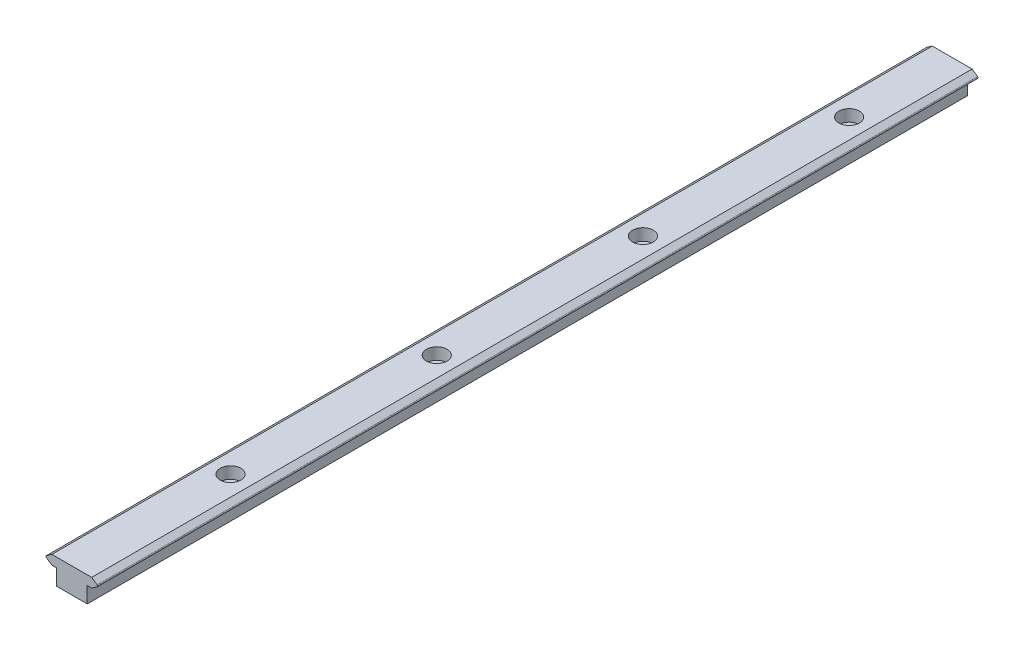
ISO-10303-21;
HEADER;
FILE_DESCRIPTION(('STEP AP214'),'2;1');
FILE_NAME('part.step','',(''),(''),'','','');
FILE_SCHEMA(('AUTOMOTIVE_DESIGN { 1 0 10303 214 1 1 1 1 }'));
ENDSEC;
DATA;
#1=APPLICATION_CONTEXT('core data for automotive mechanical design processes');
#2=APPLICATION_PROTOCOL_DEFINITION('international standard','automotive_design',2000,#1);
#3=PRODUCT_CONTEXT('',#1,'mechanical');
#4=PRODUCT('Part','Part','',(#3));
#5=PRODUCT_RELATED_PRODUCT_CATEGORY('part','',(#4));
#6=PRODUCT_DEFINITION_FORMATION('','',#4);
#7=PRODUCT_DEFINITION_CONTEXT('part definition',#1,'design');
#8=PRODUCT_DEFINITION('design','',#6,#7);
#9=PRODUCT_DEFINITION_SHAPE('','',#8);
#10=(LENGTH_UNIT() NAMED_UNIT(*) SI_UNIT(.MILLI.,.METRE.));
#11=(NAMED_UNIT(*) PLANE_ANGLE_UNIT() SI_UNIT($,.RADIAN.));
#12=(NAMED_UNIT(*) SI_UNIT($,.STERADIAN.) SOLID_ANGLE_UNIT());
#13=UNCERTAINTY_MEASURE_WITH_UNIT(LENGTH_MEASURE(1.E-05),#10,'distance_accuracy_value','');
#14=(GEOMETRIC_REPRESENTATION_CONTEXT(3) GLOBAL_UNCERTAINTY_ASSIGNED_CONTEXT((#13)) GLOBAL_UNIT_ASSIGNED_CONTEXT((#10,
#11,#12)) REPRESENTATION_CONTEXT('',''));
#15=CARTESIAN_POINT('',(0.,0.,0.));
#16=DIRECTION('',(0.,0.,1.));
#17=DIRECTION('',(1.,0.,0.));
#18=AXIS2_PLACEMENT_3D('',#15,#16,#17);
#19=CARTESIAN_POINT('',(185.15666698483,2.25000000000001,0.));
#20=DIRECTION('',(0.,1.,0.));
#21=DIRECTION('',(0.,0.,1.));
#22=AXIS2_PLACEMENT_3D('',#19,#20,#21);
#23=PLANE('',#22);
#24=CARTESIAN_POINT('',(-175.5,2.25000000000001,50.));
#25=DIRECTION('',(0.,1.,0.));
#26=DIRECTION('',(0.,0.,1.));
#27=AXIS2_PLACEMENT_3D('',#24,#25,#26);
#28=CIRCLE('',#27,5.);
#29=CARTESIAN_POINT('',(-175.5,2.25000000000001,55.));
#30=VERTEX_POINT('',#29);
#31=EDGE_CURVE('E321',#30,#30,#28,.T.);
#32=ORIENTED_EDGE('',*,*,#31,.F.);
#33=EDGE_LOOP('',(#32));
#34=FACE_BOUND('',#33,.T.);
#35=CARTESIAN_POINT('',(-175.499999999999,2.25000000000001,150.));
#36=DIRECTION('',(0.,1.,0.));
#37=DIRECTION('',(0.,0.,1.));
#38=AXIS2_PLACEMENT_3D('',#35,#36,#37);
#39=CIRCLE('',#38,5.);
#40=CARTESIAN_POINT('',(-175.499999999999,2.25000000000001,155.));
#41=VERTEX_POINT('',#40);
#42=EDGE_CURVE('E309',#41,#41,#39,.T.);
#43=ORIENTED_EDGE('',*,*,#42,.F.);
#44=EDGE_LOOP('',(#43));
#45=FACE_BOUND('',#44,.T.);
#46=CARTESIAN_POINT('',(-175.499999999997,2.25000000000001,350.));
#47=DIRECTION('',(0.,1.,0.));
#48=DIRECTION('',(0.,0.,1.));
#49=AXIS2_PLACEMENT_3D('',#46,#47,#48);
#50=CIRCLE('',#49,5.);
#51=CARTESIAN_POINT('',(-175.499999999997,2.25000000000001,355.));
#52=VERTEX_POINT('',#51);
#53=EDGE_CURVE('E297',#52,#52,#50,.T.);
#54=ORIENTED_EDGE('',*,*,#53,.F.);
#55=EDGE_LOOP('',(#54));
#56=FACE_BOUND('',#55,.T.);
#57=CARTESIAN_POINT('',(-175.499999999998,2.25000000000001,250.));
#58=DIRECTION('',(0.,1.,0.));
#59=DIRECTION('',(0.,0.,1.));
#60=AXIS2_PLACEMENT_3D('',#57,#58,#59);
#61=CIRCLE('',#60,5.);
#62=CARTESIAN_POINT('',(-175.499999999998,2.25000000000001,255.));
#63=VERTEX_POINT('',#62);
#64=EDGE_CURVE('E285',#63,#63,#61,.T.);
#65=ORIENTED_EDGE('',*,*,#64,.F.);
#66=EDGE_LOOP('',(#65));
#67=FACE_BOUND('',#66,.T.);
#68=DIRECTION('',(1.,0.,0.));
#69=VECTOR('',#68,1.);
#70=CARTESIAN_POINT('',(185.15666698483,2.25000000000001,0.));
#71=LINE('',#70,#69);
#72=CARTESIAN_POINT('',(-185.15666698483,2.25000000000001,0.));
#73=VERTEX_POINT('',#72);
#74=CARTESIAN_POINT('',(-165.84333301517,2.25000000000001,0.));
#75=VERTEX_POINT('',#74);
#76=EDGE_CURVE('E125',#73,#75,#71,.T.);
#77=ORIENTED_EDGE('',*,*,#76,.F.);
#78=DIRECTION('',(0.,0.,-1.));
#79=VECTOR('',#78,1.);
#80=CARTESIAN_POINT('',(-185.15666698483,2.25000000000001,427.));
#81=LINE('',#80,#79);
#82=CARTESIAN_POINT('',(-185.15666698483,2.25000000000001,427.));
#83=VERTEX_POINT('',#82);
#84=EDGE_CURVE('E172',#83,#73,#81,.T.);
#85=ORIENTED_EDGE('',*,*,#84,.F.);
#86=DIRECTION('',(-1.,0.,0.));
#87=VECTOR('',#86,1.);
#88=CARTESIAN_POINT('',(-165.84333301517,2.25000000000001,427.));
#89=LINE('',#88,#87);
#90=CARTESIAN_POINT('',(-165.84333301517,2.25000000000001,427.));
#91=VERTEX_POINT('',#90);
#92=EDGE_CURVE('E203',#91,#83,#89,.T.);
#93=ORIENTED_EDGE('',*,*,#92,.F.);
#94=DIRECTION('',(0.,0.,-1.));
#95=VECTOR('',#94,1.);
#96=CARTESIAN_POINT('',(-165.84333301517,2.25000000000001,427.));
#97=LINE('',#96,#95);
#98=EDGE_CURVE('E142',#91,#75,#97,.T.);
#99=ORIENTED_EDGE('',*,*,#98,.T.);
#100=EDGE_LOOP('',(#77,#85,#93,#99));
#101=FACE_BOUND('',#100,.T.);
#102=ADVANCED_FACE('F36',(#34,#45,#56,#67,#101),#23,.T.);
#103=CARTESIAN_POINT('',(0.,-2.25,0.));
#104=DIRECTION('',(0.,-1.,0.));
#105=DIRECTION('',(0.,0.,-1.));
#106=AXIS2_PLACEMENT_3D('',#103,#104,#105);
#107=PLANE('',#106);
#108=DIRECTION('',(-1.,0.,0.));
#109=VECTOR('',#108,1.);
#110=CARTESIAN_POINT('',(0.,-2.25,0.));
#111=LINE('',#110,#109);
#112=CARTESIAN_POINT('',(-183.,-2.25,0.));
#113=VERTEX_POINT('',#112);
#114=CARTESIAN_POINT('',(-185.15666698483,-2.25,0.));
#115=VERTEX_POINT('',#114);
#116=EDGE_CURVE('E237',#113,#115,#111,.T.);
#117=ORIENTED_EDGE('',*,*,#116,.F.);
#118=DIRECTION('',(0.,0.,-1.));
#119=VECTOR('',#118,1.);
#120=CARTESIAN_POINT('',(-183.,-2.25,427.));
#121=LINE('',#120,#119);
#122=CARTESIAN_POINT('',(-183.,-2.25,427.));
#123=VERTEX_POINT('',#122);
#124=EDGE_CURVE('E160',#123,#113,#121,.T.);
#125=ORIENTED_EDGE('',*,*,#124,.F.);
#126=DIRECTION('',(1.,0.,0.));
#127=VECTOR('',#126,1.);
#128=CARTESIAN_POINT('',(-185.15666698483,-2.25,427.));
#129=LINE('',#128,#127);
#130=CARTESIAN_POINT('',(-185.15666698483,-2.25,427.));
#131=VERTEX_POINT('',#130);
#132=EDGE_CURVE('E201',#131,#123,#129,.T.);
#133=ORIENTED_EDGE('',*,*,#132,.F.);
#134=DIRECTION('',(0.,0.,-1.));
#135=VECTOR('',#134,1.);
#136=CARTESIAN_POINT('',(-185.15666698483,-2.25,427.));
#137=LINE('',#136,#135);
#138=EDGE_CURVE('E163',#131,#115,#137,.T.);
#139=ORIENTED_EDGE('',*,*,#138,.T.);
#140=EDGE_LOOP('',(#117,#125,#133,#139));
#141=FACE_BOUND('',#140,.T.);
#142=ADVANCED_FACE('F227',(#141),#107,.T.);
#143=CARTESIAN_POINT('',(0.,-9.99999999999999,0.));
#144=DIRECTION('',(0.,-1.,0.));
#145=DIRECTION('',(0.,0.,-1.));
#146=AXIS2_PLACEMENT_3D('',#143,#144,#145);
#147=PLANE('',#146);
#148=CARTESIAN_POINT('',(-175.5,-10.,50.));
#149=DIRECTION('',(0.,1.,0.));
#150=DIRECTION('',(0.,0.,1.));
#151=AXIS2_PLACEMENT_3D('',#148,#149,#150);
#152=CIRCLE('',#151,2.75);
#153=CARTESIAN_POINT('',(-175.5,-10.,52.75));
#154=VERTEX_POINT('',#153);
#155=EDGE_CURVE('E312',#154,#154,#152,.T.);
#156=ORIENTED_EDGE('',*,*,#155,.T.);
#157=EDGE_LOOP('',(#156));
#158=FACE_BOUND('',#157,.T.);
#159=CARTESIAN_POINT('',(-175.499999999999,-10.,150.));
#160=DIRECTION('',(0.,1.,0.));
#161=DIRECTION('',(0.,0.,1.));
#162=AXIS2_PLACEMENT_3D('',#159,#160,#161);
#163=CIRCLE('',#162,2.75);
#164=CARTESIAN_POINT('',(-175.499999999999,-10.,152.75));
#165=VERTEX_POINT('',#164);
#166=EDGE_CURVE('E300',#165,#165,#163,.T.);
#167=ORIENTED_EDGE('',*,*,#166,.T.);
#168=EDGE_LOOP('',(#167));
#169=FACE_BOUND('',#168,.T.);
#170=CARTESIAN_POINT('',(-175.499999999997,-10.,350.));
#171=DIRECTION('',(0.,1.,0.));
#172=DIRECTION('',(0.,0.,1.));
#173=AXIS2_PLACEMENT_3D('',#170,#171,#172);
#174=CIRCLE('',#173,2.75);
#175=CARTESIAN_POINT('',(-175.499999999997,-10.,352.75));
#176=VERTEX_POINT('',#175);
#177=EDGE_CURVE('E288',#176,#176,#174,.T.);
#178=ORIENTED_EDGE('',*,*,#177,.T.);
#179=EDGE_LOOP('',(#178));
#180=FACE_BOUND('',#179,.T.);
#181=CARTESIAN_POINT('',(-175.499999999998,-10.,250.));
#182=DIRECTION('',(0.,1.,0.));
#183=DIRECTION('',(0.,0.,1.));
#184=AXIS2_PLACEMENT_3D('',#181,#182,#183);
#185=CIRCLE('',#184,2.75);
#186=CARTESIAN_POINT('',(-175.499999999998,-10.,252.75));
#187=VERTEX_POINT('',#186);
#188=EDGE_CURVE('E270',#187,#187,#185,.T.);
#189=ORIENTED_EDGE('',*,*,#188,.T.);
#190=EDGE_LOOP('',(#189));
#191=FACE_BOUND('',#190,.T.);
#192=DIRECTION('',(-1.,0.,0.));
#193=VECTOR('',#192,1.);
#194=CARTESIAN_POINT('',(0.,-9.99999999999999,0.));
#195=LINE('',#194,#193);
#196=CARTESIAN_POINT('',(-168.,-9.99999999999999,0.));
#197=VERTEX_POINT('',#196);
#198=CARTESIAN_POINT('',(-183.,-10.,0.));
#199=VERTEX_POINT('',#198);
#200=EDGE_CURVE('E269',#197,#199,#195,.T.);
#201=ORIENTED_EDGE('',*,*,#200,.F.);
#202=DIRECTION('',(0.,0.,-1.));
#203=VECTOR('',#202,1.);
#204=CARTESIAN_POINT('',(-168.,-9.99999999999999,427.));
#205=LINE('',#204,#203);
#206=CARTESIAN_POINT('',(-168.,-9.99999999999999,427.));
#207=VERTEX_POINT('',#206);
#208=EDGE_CURVE('E154',#207,#197,#205,.T.);
#209=ORIENTED_EDGE('',*,*,#208,.F.);
#210=DIRECTION('',(1.,0.,0.));
#211=VECTOR('',#210,1.);
#212=CARTESIAN_POINT('',(-183.,-10.,427.));
#213=LINE('',#212,#211);
#214=CARTESIAN_POINT('',(-183.,-10.,427.));
#215=VERTEX_POINT('',#214);
#216=EDGE_CURVE('E248',#215,#207,#213,.T.);
#217=ORIENTED_EDGE('',*,*,#216,.F.);
#218=DIRECTION('',(0.,0.,-1.));
#219=VECTOR('',#218,1.);
#220=CARTESIAN_POINT('',(-183.,-10.,427.));
#221=LINE('',#220,#219);
#222=EDGE_CURVE('E157',#215,#199,#221,.T.);
#223=ORIENTED_EDGE('',*,*,#222,.T.);
#224=EDGE_LOOP('',(#201,#209,#217,#223));
#225=FACE_BOUND('',#224,.T.);
#226=ADVANCED_FACE('F224',(#158,#169,#180,#191,#225),#147,.T.);
#227=CARTESIAN_POINT('',(168.,-2.25,0.));
#228=DIRECTION('',(0.,1.,0.));
#229=DIRECTION('',(0.,0.,1.));
#230=AXIS2_PLACEMENT_3D('',#227,#228,#229);
#231=PLANE('',#230);
#232=DIRECTION('',(0.,0.,-1.));
#233=VECTOR('',#232,1.);
#234=CARTESIAN_POINT('',(-168.,-2.25,427.));
#235=LINE('',#234,#233);
#236=CARTESIAN_POINT('',(-168.,-2.25,427.));
#237=VERTEX_POINT('',#236);
#238=CARTESIAN_POINT('',(-168.,-2.25,0.));
#239=VERTEX_POINT('',#238);
#240=EDGE_CURVE('E151',#237,#239,#235,.T.);
#241=ORIENTED_EDGE('',*,*,#240,.T.);
#242=DIRECTION('',(1.,0.,0.));
#243=VECTOR('',#242,1.);
#244=CARTESIAN_POINT('',(168.,-2.25,0.));
#245=LINE('',#244,#243);
#246=CARTESIAN_POINT('',(-165.84333301517,-2.25000000000001,0.));
#247=VERTEX_POINT('',#246);
#248=EDGE_CURVE('E266',#239,#247,#245,.T.);
#249=ORIENTED_EDGE('',*,*,#248,.T.);
#250=DIRECTION('',(0.,0.,-1.));
#251=VECTOR('',#250,1.);
#252=CARTESIAN_POINT('',(-165.84333301517,-2.25000000000001,427.));
#253=LINE('',#252,#251);
#254=CARTESIAN_POINT('',(-165.84333301517,-2.25000000000001,427.));
#255=VERTEX_POINT('',#254);
#256=EDGE_CURVE('E144',#255,#247,#253,.T.);
#257=ORIENTED_EDGE('',*,*,#256,.F.);
#258=DIRECTION('',(1.,0.,0.));
#259=VECTOR('',#258,1.);
#260=CARTESIAN_POINT('',(-168.,-2.25,427.));
#261=LINE('',#260,#259);
#262=EDGE_CURVE('E254',#237,#255,#261,.T.);
#263=ORIENTED_EDGE('',*,*,#262,.F.);
#264=EDGE_LOOP('',(#241,#249,#257,#263));
#265=FACE_BOUND('',#264,.T.);
#266=ADVANCED_FACE('F221',(#265),#231,.F.);
#267=CARTESIAN_POINT('',(-185.15666698483,2.25000000000001,427.));
#268=DIRECTION('',(0.57357643635106,-0.819152044288982,0.));
#269=DIRECTION('',(0.819152044288982,0.57357643635106,0.));
#270=AXIS2_PLACEMENT_3D('',#267,#268,#269);
#271=PLANE('',#270);
#272=DIRECTION('',(0.819152044288987,0.573576436351052,0.));
#273=VECTOR('',#272,1.);
#274=CARTESIAN_POINT('',(0.,131.898093972565,0.));
#275=LINE('',#274,#273);
#276=CARTESIAN_POINT('',(-187.785064820365,0.409576022144497,0.));
#277=VERTEX_POINT('',#276);
#278=EDGE_CURVE('E44',#73,#277,#275,.F.);
#279=ORIENTED_EDGE('',*,*,#278,.T.);
#280=DIRECTION('',(0.,0.,-1.));
#281=VECTOR('',#280,1.);
#282=CARTESIAN_POINT('',(-187.785064820365,0.409576022144497,427.));
#283=LINE('',#282,#281);
#284=CARTESIAN_POINT('',(-187.785064820365,0.409576022144497,427.));
#285=VERTEX_POINT('',#284);
#286=EDGE_CURVE('E169',#285,#277,#283,.T.);
#287=ORIENTED_EDGE('',*,*,#286,.F.);
#288=DIRECTION('',(-0.819152044288982,-0.57357643635106,0.));
#289=VECTOR('',#288,1.);
#290=CARTESIAN_POINT('',(-185.15666698483,2.25000000000001,427.));
#291=LINE('',#290,#289);
#292=EDGE_CURVE('E199',#83,#285,#291,.T.);
#293=ORIENTED_EDGE('',*,*,#292,.F.);
#294=ORIENTED_EDGE('',*,*,#84,.T.);
#295=EDGE_LOOP('',(#279,#287,#293,#294));
#296=FACE_BOUND('',#295,.T.);
#297=ADVANCED_FACE('F190',(#296),#271,.F.);
#298=CARTESIAN_POINT('',(-187.785064820365,0.409576022144497,427.));
#299=CARTESIAN_POINT('',(-187.830906121325,0.377477597650591,427.));
#300=CARTESIAN_POINT('',(-187.871837762049,0.33702194820714,427.));
#301=CARTESIAN_POINT('',(-187.90447017557,0.291559223733971,427.));
#302=CARTESIAN_POINT('',(-187.937102589091,0.246096499260798,427.));
#303=CARTESIAN_POINT('',(-187.962335817666,0.19437278168486,427.));
#304=CARTESIAN_POINT('',(-187.978080286665,0.140671334547221,427.));
#305=CARTESIAN_POINT('',(-187.993824755665,0.0869698874082328,427.));
#306=CARTESIAN_POINT('',(-188.000514716983,0.0298095584909946,427.));
#307=CARTESIAN_POINT('',(-187.997596172014,-0.0260761805142874,427.));
#308=CARTESIAN_POINT('',(-187.994677627045,-0.0819619195195737,427.));
#309=CARTESIAN_POINT('',(-187.982070078715,-0.138114466295951,427.));
#310=CARTESIAN_POINT('',(-187.960817563583,-0.189883804030459,427.));
#311=CARTESIAN_POINT('',(-187.939565048451,-0.241653141764968,427.));
#312=CARTESIAN_POINT('',(-187.90908139591,-0.290467132711145,427.));
#313=CARTESIAN_POINT('',(-187.871890970479,-0.332283469055054,427.));
#314=CARTESIAN_POINT('',(-187.846140091058,-0.36123735765941,427.));
#315=CARTESIAN_POINT('',(-187.816805619239,-0.387350875504388,427.));
#316=CARTESIAN_POINT('',(-187.785064820365,-0.409576022144494,427.));
#317=B_SPLINE_CURVE_WITH_KNOTS('',3,(#298,#299,#300,#301,#302,#303,#304,#305,#306,#307,#308,
#309,#310,#311,#312,#313,#314,#315,#316),.UNSPECIFIED.,.F.,.F.,(4,3,3,3,3,3,4),(0.,
0.000167885685985161,0.000335771371970334,0.00050365705795985,0.000671542743949376,
0.000839428429938899,0.000954805777765429),.UNSPECIFIED.);
#318=DIRECTION('',(0.,0.,-1.));
#319=VECTOR('',#318,1.);
#320=SURFACE_OF_LINEAR_EXTRUSION('',#317,#319);
#321=CARTESIAN_POINT('',(-187.785064820365,-0.409576022144494,0.));
#322=CARTESIAN_POINT('',(-187.816805619239,-0.387350875504388,0.));
#323=CARTESIAN_POINT('',(-187.846140091058,-0.36123735765941,0.));
#324=CARTESIAN_POINT('',(-187.871890970479,-0.332283469055054,0.));
#325=CARTESIAN_POINT('',(-187.90908139591,-0.290467132711145,0.));
#326=CARTESIAN_POINT('',(-187.939565048451,-0.241653141764968,0.));
#327=CARTESIAN_POINT('',(-187.960817563583,-0.189883804030459,0.));
#328=CARTESIAN_POINT('',(-187.982070078715,-0.138114466295951,0.));
#329=CARTESIAN_POINT('',(-187.994677627045,-0.0819619195195737,0.));
#330=CARTESIAN_POINT('',(-187.997596172014,-0.0260761805142874,0.));
#331=CARTESIAN_POINT('',(-188.000514716983,0.0298095584909946,0.));
#332=CARTESIAN_POINT('',(-187.993824755665,0.0869698874082328,0.));
#333=CARTESIAN_POINT('',(-187.978080286665,0.140671334547221,0.));
#334=CARTESIAN_POINT('',(-187.962335817666,0.19437278168486,0.));
#335=CARTESIAN_POINT('',(-187.937102589091,0.246096499260798,0.));
#336=CARTESIAN_POINT('',(-187.90447017557,0.291559223733971,0.));
#337=CARTESIAN_POINT('',(-187.871837762049,0.33702194820714,0.));
#338=CARTESIAN_POINT('',(-187.830906121325,0.377477597650591,0.));
#339=CARTESIAN_POINT('',(-187.785064820365,0.409576022144497,0.));
#340=B_SPLINE_CURVE_WITH_KNOTS('',3,(#321,#322,#323,#324,#325,#326,#327,#328,#329,#330,#331,
#332,#333,#334,#335,#336,#337,#338,#339),.UNSPECIFIED.,.F.,.F.,(4,3,3,3,3,3,4),(0.,
0.000115377347826541,0.000283263033816064,0.00045114871980559,0.000619034405795105,
0.000786920091780279,0.000954805777765429),.UNSPECIFIED.);
#341=CARTESIAN_POINT('',(-187.785064820365,-0.409576022144493,0.));
#342=VERTEX_POINT('',#341);
#343=EDGE_CURVE('E180',#277,#342,#340,.F.);
#344=ORIENTED_EDGE('',*,*,#343,.T.);
#345=DIRECTION('',(0.,0.,-1.));
#346=VECTOR('',#345,1.);
#347=CARTESIAN_POINT('',(-187.785064820365,-0.409576022144494,427.));
#348=LINE('',#347,#346);
#349=CARTESIAN_POINT('',(-187.785064820365,-0.409576022144494,427.));
#350=VERTEX_POINT('',#349);
#351=EDGE_CURVE('E166',#350,#342,#348,.T.);
#352=ORIENTED_EDGE('',*,*,#351,.F.);
#353=EDGE_CURVE('E196',#285,#350,#317,.T.);
#354=ORIENTED_EDGE('',*,*,#353,.F.);
#355=ORIENTED_EDGE('',*,*,#286,.T.);
#356=EDGE_LOOP('',(#344,#352,#354,#355));
#357=FACE_BOUND('',#356,.T.);
#358=ADVANCED_FACE('F194',(#357),#320,.F.);
#359=CARTESIAN_POINT('',(-187.785064820365,-0.409576022144494,427.));
#360=DIRECTION('',(0.57357643635105,0.819152044288989,0.));
#361=DIRECTION('',(-0.819152044288989,0.57357643635105,0.));
#362=AXIS2_PLACEMENT_3D('',#359,#360,#361);
#363=PLANE('',#362);
#364=DIRECTION('',(-0.819152044288988,0.573576436351051,0.));
#365=VECTOR('',#364,1.);
#366=CARTESIAN_POINT('',(0.,-131.898093972565,0.));
#367=LINE('',#366,#365);
#368=EDGE_CURVE('E177',#342,#115,#367,.F.);
#369=ORIENTED_EDGE('',*,*,#368,.T.);
#370=ORIENTED_EDGE('',*,*,#138,.F.);
#371=DIRECTION('',(0.819152044288989,-0.57357643635105,0.));
#372=VECTOR('',#371,1.);
#373=CARTESIAN_POINT('',(-187.785064820365,-0.409576022144494,427.));
#374=LINE('',#373,#372);
#375=EDGE_CURVE('E198',#350,#131,#374,.T.);
#376=ORIENTED_EDGE('',*,*,#375,.F.);
#377=ORIENTED_EDGE('',*,*,#351,.T.);
#378=EDGE_LOOP('',(#369,#370,#376,#377));
#379=FACE_BOUND('',#378,.T.);
#380=ADVANCED_FACE('F217',(#379),#363,.F.);
#381=CARTESIAN_POINT('',(-183.,-2.25,427.));
#382=DIRECTION('',(1.,0.,0.));
#383=DIRECTION('',(0.,0.,-1.));
#384=AXIS2_PLACEMENT_3D('',#381,#382,#383);
#385=PLANE('',#384);
#386=DIRECTION('',(0.,1.,0.));
#387=VECTOR('',#386,1.);
#388=CARTESIAN_POINT('',(-183.,-9.99999999999999,0.));
#389=LINE('',#388,#387);
#390=EDGE_CURVE('E129',#199,#113,#389,.T.);
#391=ORIENTED_EDGE('',*,*,#390,.F.);
#392=ORIENTED_EDGE('',*,*,#222,.F.);
#393=DIRECTION('',(0.,-1.,0.));
#394=VECTOR('',#393,1.);
#395=CARTESIAN_POINT('',(-183.,-2.25,427.));
#396=LINE('',#395,#394);
#397=EDGE_CURVE('E246',#123,#215,#396,.T.);
#398=ORIENTED_EDGE('',*,*,#397,.F.);
#399=ORIENTED_EDGE('',*,*,#124,.T.);
#400=EDGE_LOOP('',(#391,#392,#398,#399));
#401=FACE_BOUND('',#400,.T.);
#402=ADVANCED_FACE('F244',(#401),#385,.F.);
#403=CARTESIAN_POINT('',(-168.,-9.99999999999999,427.));
#404=DIRECTION('',(-1.,0.,0.));
#405=DIRECTION('',(0.,0.,1.));
#406=AXIS2_PLACEMENT_3D('',#403,#404,#405);
#407=PLANE('',#406);
#408=DIRECTION('',(0.,-1.,0.));
#409=VECTOR('',#408,1.);
#410=CARTESIAN_POINT('',(-168.,2.24999999999999,0.));
#411=LINE('',#410,#409);
#412=EDGE_CURVE('E11',#239,#197,#411,.T.);
#413=ORIENTED_EDGE('',*,*,#412,.F.);
#414=ORIENTED_EDGE('',*,*,#240,.F.);
#415=DIRECTION('',(0.,1.,0.));
#416=VECTOR('',#415,1.);
#417=CARTESIAN_POINT('',(-168.,-9.99999999999999,427.));
#418=LINE('',#417,#416);
#419=EDGE_CURVE('E250',#207,#237,#418,.T.);
#420=ORIENTED_EDGE('',*,*,#419,.F.);
#421=ORIENTED_EDGE('',*,*,#208,.T.);
#422=EDGE_LOOP('',(#413,#414,#420,#421));
#423=FACE_BOUND('',#422,.T.);
#424=ADVANCED_FACE('F365',(#423),#407,.F.);
#425=CARTESIAN_POINT('',(-165.84333301517,-2.25000000000001,427.));
#426=DIRECTION('',(-0.573576436351046,0.819152044288992,0.));
#427=DIRECTION('',(-0.819152044288992,-0.573576436351046,0.));
#428=AXIS2_PLACEMENT_3D('',#425,#426,#427);
#429=PLANE('',#428);
#430=DIRECTION('',(0.819152044288994,0.573576436351042,0.));
#431=VECTOR('',#430,1.);
#432=CARTESIAN_POINT('',(0.,113.874751939044,0.));
#433=LINE('',#432,#431);
#434=CARTESIAN_POINT('',(-163.214935179635,-0.409576022144504,0.));
#435=VERTEX_POINT('',#434);
#436=EDGE_CURVE('E139',#435,#247,#433,.F.);
#437=ORIENTED_EDGE('',*,*,#436,.F.);
#438=DIRECTION('',(0.,0.,-1.));
#439=VECTOR('',#438,1.);
#440=CARTESIAN_POINT('',(-163.214935179635,-0.409576022144503,427.));
#441=LINE('',#440,#439);
#442=CARTESIAN_POINT('',(-163.214935179635,-0.409576022144503,427.));
#443=VERTEX_POINT('',#442);
#444=EDGE_CURVE('E138',#443,#435,#441,.T.);
#445=ORIENTED_EDGE('',*,*,#444,.F.);
#446=DIRECTION('',(0.819152044288992,0.573576436351046,0.));
#447=VECTOR('',#446,1.);
#448=CARTESIAN_POINT('',(-165.84333301517,-2.25000000000001,427.));
#449=LINE('',#448,#447);
#450=EDGE_CURVE('E256',#255,#443,#449,.T.);
#451=ORIENTED_EDGE('',*,*,#450,.F.);
#452=ORIENTED_EDGE('',*,*,#256,.T.);
#453=EDGE_LOOP('',(#437,#445,#451,#452));
#454=FACE_BOUND('',#453,.T.);
#455=ADVANCED_FACE('F264',(#454),#429,.F.);
#456=CARTESIAN_POINT('',(-163.501723397811,0.,427.));
#457=DIRECTION('',(0.,0.,-1.));
#458=DIRECTION('',(-1.,0.,0.));
#459=AXIS2_PLACEMENT_3D('',#456,#457,#458);
#460=CYLINDRICAL_SURFACE('',#459,0.499999999999985);
#461=CARTESIAN_POINT('',(-163.501723397811,0.,0.));
#462=DIRECTION('',(0.,0.,-1.));
#463=DIRECTION('',(-1.,0.,0.));
#464=AXIS2_PLACEMENT_3D('',#461,#462,#463);
#465=CIRCLE('',#464,0.499999999999988);
#466=CARTESIAN_POINT('',(-163.214935179635,0.4095760221445,0.));
#467=VERTEX_POINT('',#466);
#468=EDGE_CURVE('E122',#467,#435,#465,.T.);
#469=ORIENTED_EDGE('',*,*,#468,.F.);
#470=DIRECTION('',(0.,0.,-1.));
#471=VECTOR('',#470,1.);
#472=CARTESIAN_POINT('',(-163.214935179635,0.4095760221445,427.));
#473=LINE('',#472,#471);
#474=CARTESIAN_POINT('',(-163.214935179635,0.4095760221445,427.));
#475=VERTEX_POINT('',#474);
#476=EDGE_CURVE('E136',#475,#467,#473,.T.);
#477=ORIENTED_EDGE('',*,*,#476,.F.);
#478=CARTESIAN_POINT('',(-163.501723397811,0.,427.));
#479=DIRECTION('',(0.,0.,1.));
#480=DIRECTION('',(1.,0.,0.));
#481=AXIS2_PLACEMENT_3D('',#478,#479,#480);
#482=CIRCLE('',#481,0.499999999999985);
#483=EDGE_CURVE('E258',#443,#475,#482,.T.);
#484=ORIENTED_EDGE('',*,*,#483,.F.);
#485=ORIENTED_EDGE('',*,*,#444,.T.);
#486=EDGE_LOOP('',(#469,#477,#484,#485));
#487=FACE_BOUND('',#486,.T.);
#488=ADVANCED_FACE('F134',(#487),#460,.T.);
#489=CARTESIAN_POINT('',(-163.214935179635,0.409576022144501,427.));
#490=DIRECTION('',(-0.573576436351043,-0.819152044288994,0.));
#491=DIRECTION('',(0.819152044288994,-0.573576436351043,0.));
#492=AXIS2_PLACEMENT_3D('',#489,#490,#491);
#493=PLANE('',#492);
#494=DIRECTION('',(-0.819152044288994,0.573576436351043,0.));
#495=VECTOR('',#494,1.);
#496=CARTESIAN_POINT('',(0.,-113.874751939044,0.));
#497=LINE('',#496,#495);
#498=EDGE_CURVE('E119',#75,#467,#497,.F.);
#499=ORIENTED_EDGE('',*,*,#498,.F.);
#500=ORIENTED_EDGE('',*,*,#98,.F.);
#501=DIRECTION('',(-0.819152044288994,0.573576436351043,0.));
#502=VECTOR('',#501,1.);
#503=CARTESIAN_POINT('',(-163.214935179635,0.409576022144501,427.));
#504=LINE('',#503,#502);
#505=EDGE_CURVE('E51',#475,#91,#504,.T.);
#506=ORIENTED_EDGE('',*,*,#505,.F.);
#507=ORIENTED_EDGE('',*,*,#476,.T.);
#508=EDGE_LOOP('',(#499,#500,#506,#507));
#509=FACE_BOUND('',#508,.T.);
#510=ADVANCED_FACE('F141',(#509),#493,.F.);
#511=CARTESIAN_POINT('',(-187.998262577006,0.00021766863377327,427.));
#512=DIRECTION('',(0.,0.,-1.));
#513=DIRECTION('',(-1.,0.,0.));
#514=AXIS2_PLACEMENT_3D('',#511,#512,#513);
#515=PLANE('',#514);
#516=ORIENTED_EDGE('',*,*,#92,.T.);
#517=ORIENTED_EDGE('',*,*,#292,.T.);
#518=ORIENTED_EDGE('',*,*,#353,.T.);
#519=ORIENTED_EDGE('',*,*,#375,.T.);
#520=ORIENTED_EDGE('',*,*,#132,.T.);
#521=ORIENTED_EDGE('',*,*,#397,.T.);
#522=ORIENTED_EDGE('',*,*,#216,.T.);
#523=ORIENTED_EDGE('',*,*,#419,.T.);
#524=ORIENTED_EDGE('',*,*,#262,.T.);
#525=ORIENTED_EDGE('',*,*,#450,.T.);
#526=ORIENTED_EDGE('',*,*,#483,.T.);
#527=ORIENTED_EDGE('',*,*,#505,.T.);
#528=EDGE_LOOP('',(#516,#517,#518,#519,#520,#521,#522,#523,#524,#525,#526,#527));
#529=FACE_BOUND('',#528,.T.);
#530=ADVANCED_FACE('F259',(#529),#515,.F.);
#531=CARTESIAN_POINT('',(0.,0.,0.));
#532=DIRECTION('',(0.,0.,1.));
#533=DIRECTION('',(1.,0.,0.));
#534=AXIS2_PLACEMENT_3D('',#531,#532,#533);
#535=PLANE('',#534);
#536=ORIENTED_EDGE('',*,*,#116,.T.);
#537=ORIENTED_EDGE('',*,*,#368,.F.);
#538=ORIENTED_EDGE('',*,*,#343,.F.);
#539=ORIENTED_EDGE('',*,*,#278,.F.);
#540=ORIENTED_EDGE('',*,*,#76,.T.);
#541=ORIENTED_EDGE('',*,*,#498,.T.);
#542=ORIENTED_EDGE('',*,*,#468,.T.);
#543=ORIENTED_EDGE('',*,*,#436,.T.);
#544=ORIENTED_EDGE('',*,*,#248,.F.);
#545=ORIENTED_EDGE('',*,*,#412,.T.);
#546=ORIENTED_EDGE('',*,*,#200,.T.);
#547=ORIENTED_EDGE('',*,*,#390,.T.);
#548=EDGE_LOOP('',(#536,#537,#538,#539,#540,#541,#542,#543,#544,#545,#546,#547));
#549=FACE_BOUND('',#548,.T.);
#550=ADVANCED_FACE('F121',(#549),#535,.F.);
#551=CARTESIAN_POINT('',(-175.499999999998,2.25000000000001,250.));
#552=DIRECTION('',(0.,1.,0.));
#553=DIRECTION('',(0.,0.,1.));
#554=AXIS2_PLACEMENT_3D('',#551,#552,#553);
#555=CYLINDRICAL_SURFACE('',#554,2.75);
#556=ORIENTED_EDGE('',*,*,#188,.F.);
#557=EDGE_LOOP('',(#556));
#558=FACE_BOUND('',#557,.T.);
#559=CARTESIAN_POINT('',(-175.499999999998,-3.44999999999999,250.));
#560=DIRECTION('',(0.,1.,0.));
#561=DIRECTION('',(0.,0.,1.));
#562=AXIS2_PLACEMENT_3D('',#559,#560,#561);
#563=CIRCLE('',#562,2.75);
#564=CARTESIAN_POINT('',(-175.499999999998,-3.44999999999999,252.75));
#565=VERTEX_POINT('',#564);
#566=EDGE_CURVE('E274',#565,#565,#563,.T.);
#567=ORIENTED_EDGE('',*,*,#566,.T.);
#568=EDGE_LOOP('',(#567));
#569=FACE_BOUND('',#568,.T.);
#570=ADVANCED_FACE('F346',(#558,#569),#555,.F.);
#571=CARTESIAN_POINT('',(-172.749999999998,-3.44999999999999,250.));
#572=DIRECTION('',(0.,-1.,0.));
#573=DIRECTION('',(0.,0.,-1.));
#574=AXIS2_PLACEMENT_3D('',#571,#572,#573);
#575=PLANE('',#574);
#576=ORIENTED_EDGE('',*,*,#566,.F.);
#577=EDGE_LOOP('',(#576));
#578=FACE_BOUND('',#577,.T.);
#579=CARTESIAN_POINT('',(-175.499999999998,-3.44999999999999,250.));
#580=DIRECTION('',(0.,1.,0.));
#581=DIRECTION('',(0.,0.,1.));
#582=AXIS2_PLACEMENT_3D('',#579,#580,#581);
#583=CIRCLE('',#582,5.);
#584=CARTESIAN_POINT('',(-175.499999999998,-3.44999999999999,255.));
#585=VERTEX_POINT('',#584);
#586=EDGE_CURVE('E282',#585,#585,#583,.T.);
#587=ORIENTED_EDGE('',*,*,#586,.T.);
#588=EDGE_LOOP('',(#587));
#589=FACE_BOUND('',#588,.T.);
#590=ADVANCED_FACE('F336',(#578,#589),#575,.F.);
#591=CARTESIAN_POINT('',(-175.499999999998,2.25000000000001,250.));
#592=DIRECTION('',(0.,1.,0.));
#593=DIRECTION('',(0.,0.,1.));
#594=AXIS2_PLACEMENT_3D('',#591,#592,#593);
#595=CYLINDRICAL_SURFACE('',#594,5.);
#596=ORIENTED_EDGE('',*,*,#586,.F.);
#597=EDGE_LOOP('',(#596));
#598=FACE_BOUND('',#597,.T.);
#599=ORIENTED_EDGE('',*,*,#64,.T.);
#600=EDGE_LOOP('',(#599));
#601=FACE_BOUND('',#600,.T.);
#602=ADVANCED_FACE('F333',(#598,#601),#595,.F.);
#603=CARTESIAN_POINT('',(-175.499999999997,2.25000000000001,350.));
#604=DIRECTION('',(0.,1.,0.));
#605=DIRECTION('',(0.,0.,1.));
#606=AXIS2_PLACEMENT_3D('',#603,#604,#605);
#607=CYLINDRICAL_SURFACE('',#606,2.75);
#608=ORIENTED_EDGE('',*,*,#177,.F.);
#609=EDGE_LOOP('',(#608));
#610=FACE_BOUND('',#609,.T.);
#611=CARTESIAN_POINT('',(-175.499999999997,-3.44999999999999,350.));
#612=DIRECTION('',(0.,1.,0.));
#613=DIRECTION('',(0.,0.,1.));
#614=AXIS2_PLACEMENT_3D('',#611,#612,#613);
#615=CIRCLE('',#614,2.75);
#616=CARTESIAN_POINT('',(-175.499999999997,-3.44999999999999,352.75));
#617=VERTEX_POINT('',#616);
#618=EDGE_CURVE('E291',#617,#617,#615,.T.);
#619=ORIENTED_EDGE('',*,*,#618,.T.);
#620=EDGE_LOOP('',(#619));
#621=FACE_BOUND('',#620,.T.);
#622=ADVANCED_FACE('F335',(#610,#621),#607,.F.);
#623=CARTESIAN_POINT('',(-172.749999999997,-3.44999999999999,350.));
#624=DIRECTION('',(0.,-1.,0.));
#625=DIRECTION('',(0.,0.,-1.));
#626=AXIS2_PLACEMENT_3D('',#623,#624,#625);
#627=PLANE('',#626);
#628=ORIENTED_EDGE('',*,*,#618,.F.);
#629=EDGE_LOOP('',(#628));
#630=FACE_BOUND('',#629,.T.);
#631=CARTESIAN_POINT('',(-175.499999999997,-3.44999999999999,350.));
#632=DIRECTION('',(0.,1.,0.));
#633=DIRECTION('',(0.,0.,1.));
#634=AXIS2_PLACEMENT_3D('',#631,#632,#633);
#635=CIRCLE('',#634,5.);
#636=CARTESIAN_POINT('',(-175.499999999997,-3.44999999999999,355.));
#637=VERTEX_POINT('',#636);
#638=EDGE_CURVE('E294',#637,#637,#635,.T.);
#639=ORIENTED_EDGE('',*,*,#638,.T.);
#640=EDGE_LOOP('',(#639));
#641=FACE_BOUND('',#640,.T.);
#642=ADVANCED_FACE('F343',(#630,#641),#627,.F.);
#643=CARTESIAN_POINT('',(-175.499999999997,2.25000000000001,350.));
#644=DIRECTION('',(0.,1.,0.));
#645=DIRECTION('',(0.,0.,1.));
#646=AXIS2_PLACEMENT_3D('',#643,#644,#645);
#647=CYLINDRICAL_SURFACE('',#646,5.);
#648=ORIENTED_EDGE('',*,*,#638,.F.);
#649=EDGE_LOOP('',(#648));
#650=FACE_BOUND('',#649,.T.);
#651=ORIENTED_EDGE('',*,*,#53,.T.);
#652=EDGE_LOOP('',(#651));
#653=FACE_BOUND('',#652,.T.);
#654=ADVANCED_FACE('F429',(#650,#653),#647,.F.);
#655=CARTESIAN_POINT('',(-175.499999999999,2.25000000000001,150.));
#656=DIRECTION('',(0.,1.,0.));
#657=DIRECTION('',(0.,0.,1.));
#658=AXIS2_PLACEMENT_3D('',#655,#656,#657);
#659=CYLINDRICAL_SURFACE('',#658,2.75);
#660=ORIENTED_EDGE('',*,*,#166,.F.);
#661=EDGE_LOOP('',(#660));
#662=FACE_BOUND('',#661,.T.);
#663=CARTESIAN_POINT('',(-175.499999999999,-3.44999999999999,150.));
#664=DIRECTION('',(0.,1.,0.));
#665=DIRECTION('',(0.,0.,1.));
#666=AXIS2_PLACEMENT_3D('',#663,#664,#665);
#667=CIRCLE('',#666,2.75);
#668=CARTESIAN_POINT('',(-175.499999999999,-3.44999999999999,152.75));
#669=VERTEX_POINT('',#668);
#670=EDGE_CURVE('E303',#669,#669,#667,.T.);
#671=ORIENTED_EDGE('',*,*,#670,.T.);
#672=EDGE_LOOP('',(#671));
#673=FACE_BOUND('',#672,.T.);
#674=ADVANCED_FACE('F438',(#662,#673),#659,.F.);
#675=CARTESIAN_POINT('',(-172.749999999999,-3.44999999999999,150.));
#676=DIRECTION('',(0.,-1.,0.));
#677=DIRECTION('',(0.,0.,-1.));
#678=AXIS2_PLACEMENT_3D('',#675,#676,#677);
#679=PLANE('',#678);
#680=ORIENTED_EDGE('',*,*,#670,.F.);
#681=EDGE_LOOP('',(#680));
#682=FACE_BOUND('',#681,.T.);
#683=CARTESIAN_POINT('',(-175.499999999999,-3.44999999999999,150.));
#684=DIRECTION('',(0.,1.,0.));
#685=DIRECTION('',(0.,0.,1.));
#686=AXIS2_PLACEMENT_3D('',#683,#684,#685);
#687=CIRCLE('',#686,5.);
#688=CARTESIAN_POINT('',(-175.499999999999,-3.44999999999999,155.));
#689=VERTEX_POINT('',#688);
#690=EDGE_CURVE('E306',#689,#689,#687,.T.);
#691=ORIENTED_EDGE('',*,*,#690,.T.);
#692=EDGE_LOOP('',(#691));
#693=FACE_BOUND('',#692,.T.);
#694=ADVANCED_FACE('F448',(#682,#693),#679,.F.);
#695=CARTESIAN_POINT('',(-175.499999999999,2.25000000000001,150.));
#696=DIRECTION('',(0.,1.,0.));
#697=DIRECTION('',(0.,0.,1.));
#698=AXIS2_PLACEMENT_3D('',#695,#696,#697);
#699=CYLINDRICAL_SURFACE('',#698,5.);
#700=ORIENTED_EDGE('',*,*,#690,.F.);
#701=EDGE_LOOP('',(#700));
#702=FACE_BOUND('',#701,.T.);
#703=ORIENTED_EDGE('',*,*,#42,.T.);
#704=EDGE_LOOP('',(#703));
#705=FACE_BOUND('',#704,.T.);
#706=ADVANCED_FACE('F458',(#702,#705),#699,.F.);
#707=CARTESIAN_POINT('',(-175.5,2.25000000000001,50.));
#708=DIRECTION('',(0.,1.,0.));
#709=DIRECTION('',(0.,0.,1.));
#710=AXIS2_PLACEMENT_3D('',#707,#708,#709);
#711=CYLINDRICAL_SURFACE('',#710,2.75);
#712=ORIENTED_EDGE('',*,*,#155,.F.);
#713=EDGE_LOOP('',(#712));
#714=FACE_BOUND('',#713,.T.);
#715=CARTESIAN_POINT('',(-175.5,-3.44999999999999,50.));
#716=DIRECTION('',(0.,1.,0.));
#717=DIRECTION('',(0.,0.,1.));
#718=AXIS2_PLACEMENT_3D('',#715,#716,#717);
#719=CIRCLE('',#718,2.75);
#720=CARTESIAN_POINT('',(-175.5,-3.44999999999999,52.75));
#721=VERTEX_POINT('',#720);
#722=EDGE_CURVE('E315',#721,#721,#719,.T.);
#723=ORIENTED_EDGE('',*,*,#722,.T.);
#724=EDGE_LOOP('',(#723));
#725=FACE_BOUND('',#724,.T.);
#726=ADVANCED_FACE('F468',(#714,#725),#711,.F.);
#727=CARTESIAN_POINT('',(-172.75,-3.44999999999999,50.));
#728=DIRECTION('',(0.,-1.,0.));
#729=DIRECTION('',(0.,0.,-1.));
#730=AXIS2_PLACEMENT_3D('',#727,#728,#729);
#731=PLANE('',#730);
#732=ORIENTED_EDGE('',*,*,#722,.F.);
#733=EDGE_LOOP('',(#732));
#734=FACE_BOUND('',#733,.T.);
#735=CARTESIAN_POINT('',(-175.5,-3.44999999999999,50.));
#736=DIRECTION('',(0.,1.,0.));
#737=DIRECTION('',(0.,0.,1.));
#738=AXIS2_PLACEMENT_3D('',#735,#736,#737);
#739=CIRCLE('',#738,5.);
#740=CARTESIAN_POINT('',(-175.5,-3.44999999999999,55.));
#741=VERTEX_POINT('',#740);
#742=EDGE_CURVE('E318',#741,#741,#739,.T.);
#743=ORIENTED_EDGE('',*,*,#742,.T.);
#744=EDGE_LOOP('',(#743));
#745=FACE_BOUND('',#744,.T.);
#746=ADVANCED_FACE('F478',(#734,#745),#731,.F.);
#747=CARTESIAN_POINT('',(-175.5,2.25000000000001,50.));
#748=DIRECTION('',(0.,1.,0.));
#749=DIRECTION('',(0.,0.,1.));
#750=AXIS2_PLACEMENT_3D('',#747,#748,#749);
#751=CYLINDRICAL_SURFACE('',#750,5.);
#752=ORIENTED_EDGE('',*,*,#742,.F.);
#753=EDGE_LOOP('',(#752));
#754=FACE_BOUND('',#753,.T.);
#755=ORIENTED_EDGE('',*,*,#31,.T.);
#756=EDGE_LOOP('',(#755));
#757=FACE_BOUND('',#756,.T.);
#758=ADVANCED_FACE('F325',(#754,#757),#751,.F.);
#759=CLOSED_SHELL('',(#102,#142,#226,#266,#297,#358,#380,#402,#424,#455,#488,#510,#530,#550,
#570,#590,#602,#622,#642,#654,#674,#694,#706,#726,#746,#758));
#760=MANIFOLD_SOLID_BREP('B2',#759);
#761=ADVANCED_BREP_SHAPE_REPRESENTATION('',(#18,#760),#14);
#762=SHAPE_DEFINITION_REPRESENTATION(#9,#761);
ENDSEC;
END-ISO-10303-21;
